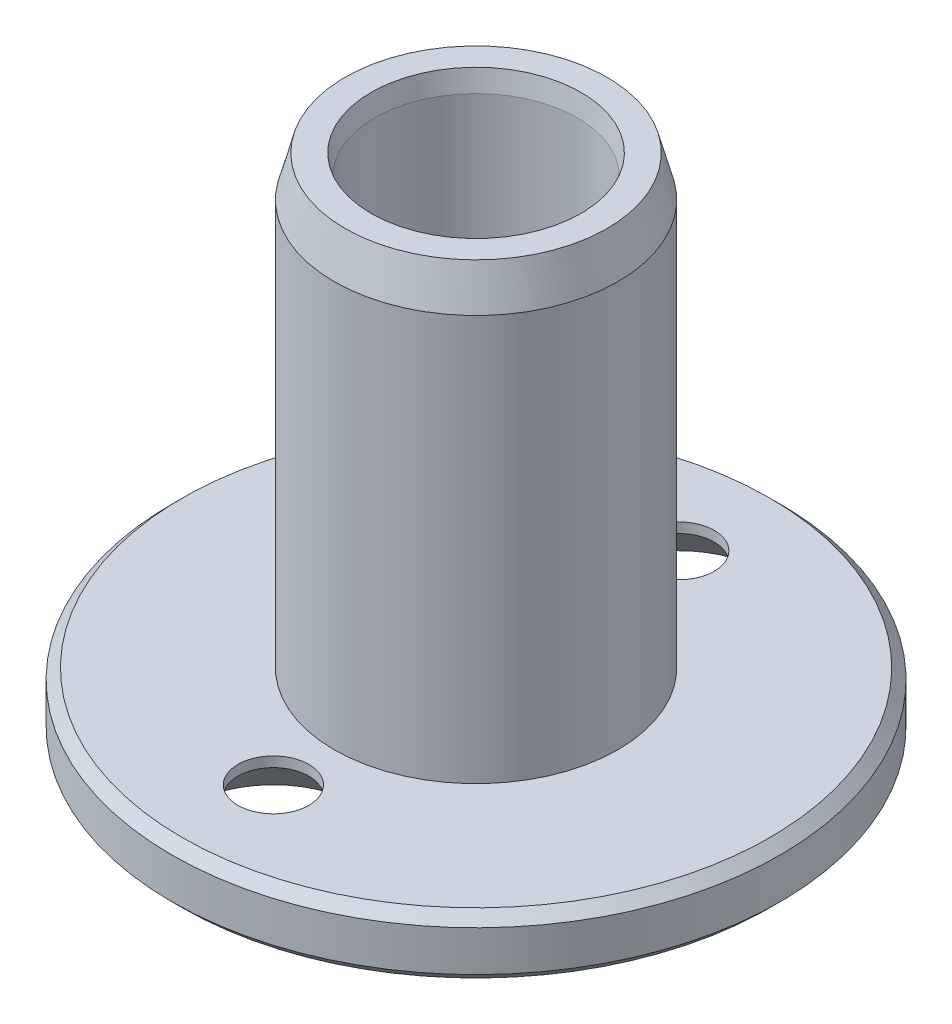
ISO-10303-21;
HEADER;
FILE_DESCRIPTION(('STEP AP214'),'2;1');
FILE_NAME('part.step','',(''),(''),'','','');
FILE_SCHEMA(('AUTOMOTIVE_DESIGN { 1 0 10303 214 1 1 1 1 }'));
ENDSEC;
DATA;
#1=APPLICATION_CONTEXT('core data for automotive mechanical design processes');
#2=APPLICATION_PROTOCOL_DEFINITION('international standard','automotive_design',2000,#1);
#3=PRODUCT_CONTEXT('',#1,'mechanical');
#4=PRODUCT('Part','Part','',(#3));
#5=PRODUCT_RELATED_PRODUCT_CATEGORY('part','',(#4));
#6=PRODUCT_DEFINITION_FORMATION('','',#4);
#7=PRODUCT_DEFINITION_CONTEXT('part definition',#1,'design');
#8=PRODUCT_DEFINITION('design','',#6,#7);
#9=PRODUCT_DEFINITION_SHAPE('','',#8);
#10=(LENGTH_UNIT() NAMED_UNIT(*) SI_UNIT(.MILLI.,.METRE.));
#11=(NAMED_UNIT(*) PLANE_ANGLE_UNIT() SI_UNIT($,.RADIAN.));
#12=(NAMED_UNIT(*) SI_UNIT($,.STERADIAN.) SOLID_ANGLE_UNIT());
#13=UNCERTAINTY_MEASURE_WITH_UNIT(LENGTH_MEASURE(1.E-05),#10,'distance_accuracy_value','');
#14=(GEOMETRIC_REPRESENTATION_CONTEXT(3) GLOBAL_UNCERTAINTY_ASSIGNED_CONTEXT((#13)) GLOBAL_UNIT_ASSIGNED_CONTEXT((#10,
#11,#12)) REPRESENTATION_CONTEXT('',''));
#15=CARTESIAN_POINT('',(0.,0.,0.));
#16=DIRECTION('',(0.,0.,1.));
#17=DIRECTION('',(1.,0.,0.));
#18=AXIS2_PLACEMENT_3D('',#15,#16,#17);
#19=CARTESIAN_POINT('',(0.,3.,0.));
#20=DIRECTION('',(0.,1.,0.));
#21=DIRECTION('',(0.,0.,1.));
#22=AXIS2_PLACEMENT_3D('',#19,#20,#21);
#23=PLANE('',#22);
#24=CARTESIAN_POINT('',(0.,3.,0.));
#25=DIRECTION('',(0.,1.,0.));
#26=DIRECTION('',(0.,0.,1.));
#27=AXIS2_PLACEMENT_3D('',#24,#25,#26);
#28=CIRCLE('',#27,14.5);
#29=CARTESIAN_POINT('',(0.,3.,14.5));
#30=VERTEX_POINT('',#29);
#31=EDGE_CURVE('E11',#30,#30,#28,.T.);
#32=ORIENTED_EDGE('',*,*,#31,.T.);
#33=EDGE_LOOP('',(#32));
#34=FACE_BOUND('',#33,.T.);
#35=CARTESIAN_POINT('',(0.,3.,-10.));
#36=DIRECTION('',(0.,1.,0.));
#37=DIRECTION('',(0.,0.,1.));
#38=AXIS2_PLACEMENT_3D('',#35,#36,#37);
#39=CIRCLE('',#38,1.75);
#40=CARTESIAN_POINT('',(0.,3.,-8.25));
#41=VERTEX_POINT('',#40);
#42=EDGE_CURVE('E105',#41,#41,#39,.F.);
#43=ORIENTED_EDGE('',*,*,#42,.T.);
#44=EDGE_LOOP('',(#43));
#45=FACE_BOUND('',#44,.T.);
#46=CARTESIAN_POINT('',(0.,3.,10.));
#47=DIRECTION('',(0.,1.,0.));
#48=DIRECTION('',(0.,0.,1.));
#49=AXIS2_PLACEMENT_3D('',#46,#47,#48);
#50=CIRCLE('',#49,1.75);
#51=CARTESIAN_POINT('',(0.,3.,11.75));
#52=VERTEX_POINT('',#51);
#53=EDGE_CURVE('E102',#52,#52,#50,.T.);
#54=ORIENTED_EDGE('',*,*,#53,.F.);
#55=EDGE_LOOP('',(#54));
#56=FACE_BOUND('',#55,.T.);
#57=CARTESIAN_POINT('',(0.,3.,0.));
#58=DIRECTION('',(0.,1.,0.));
#59=DIRECTION('',(0.,0.,1.));
#60=AXIS2_PLACEMENT_3D('',#57,#58,#59);
#61=CIRCLE('',#60,7.);
#62=CARTESIAN_POINT('',(0.,3.,7.));
#63=VERTEX_POINT('',#62);
#64=EDGE_CURVE('E99',#63,#63,#61,.F.);
#65=ORIENTED_EDGE('',*,*,#64,.T.);
#66=EDGE_LOOP('',(#65));
#67=FACE_BOUND('',#66,.T.);
#68=ADVANCED_FACE('F48',(#34,#45,#56,#67),#23,.T.);
#69=CARTESIAN_POINT('',(0.,0.,0.));
#70=DIRECTION('',(0.,1.,0.));
#71=DIRECTION('',(0.,0.,1.));
#72=AXIS2_PLACEMENT_3D('',#69,#70,#71);
#73=PLANE('',#72);
#74=CARTESIAN_POINT('',(0.,0.,0.));
#75=DIRECTION('',(0.,1.,0.));
#76=DIRECTION('',(0.,0.,1.));
#77=AXIS2_PLACEMENT_3D('',#74,#75,#76);
#78=CIRCLE('',#77,14.5);
#79=CARTESIAN_POINT('',(0.,0.,14.5));
#80=VERTEX_POINT('',#79);
#81=EDGE_CURVE('E56',#80,#80,#78,.F.);
#82=ORIENTED_EDGE('',*,*,#81,.T.);
#83=EDGE_LOOP('',(#82));
#84=FACE_BOUND('',#83,.T.);
#85=CARTESIAN_POINT('',(0.,0.,0.));
#86=DIRECTION('',(0.,1.,0.));
#87=DIRECTION('',(0.,0.,1.));
#88=AXIS2_PLACEMENT_3D('',#85,#86,#87);
#89=CIRCLE('',#88,5.17632698070847);
#90=CARTESIAN_POINT('',(0.,0.,5.17632698070847));
#91=VERTEX_POINT('',#90);
#92=EDGE_CURVE('E69',#91,#91,#89,.T.);
#93=ORIENTED_EDGE('',*,*,#92,.T.);
#94=EDGE_LOOP('',(#93));
#95=FACE_BOUND('',#94,.T.);
#96=CARTESIAN_POINT('',(0.,0.,-10.));
#97=DIRECTION('',(0.,1.,0.));
#98=DIRECTION('',(0.,0.,1.));
#99=AXIS2_PLACEMENT_3D('',#96,#97,#98);
#100=CIRCLE('',#99,4.25000000000004);
#101=CARTESIAN_POINT('',(0.,0.,-5.74999999999996));
#102=VERTEX_POINT('',#101);
#103=EDGE_CURVE('E90',#102,#102,#100,.T.);
#104=ORIENTED_EDGE('',*,*,#103,.T.);
#105=EDGE_LOOP('',(#104));
#106=FACE_BOUND('',#105,.T.);
#107=CARTESIAN_POINT('',(0.,0.,10.));
#108=DIRECTION('',(0.,1.,0.));
#109=DIRECTION('',(0.,0.,1.));
#110=AXIS2_PLACEMENT_3D('',#107,#108,#109);
#111=CIRCLE('',#110,4.24999999999999);
#112=CARTESIAN_POINT('',(0.,0.,14.25));
#113=VERTEX_POINT('',#112);
#114=EDGE_CURVE('E93',#113,#113,#111,.T.);
#115=ORIENTED_EDGE('',*,*,#114,.T.);
#116=EDGE_LOOP('',(#115));
#117=FACE_BOUND('',#116,.T.);
#118=ADVANCED_FACE('F129',(#84,#95,#106,#117),#73,.F.);
#119=CARTESIAN_POINT('',(0.,3.,0.));
#120=DIRECTION('',(0.,-1.,0.));
#121=DIRECTION('',(0.,0.,-1.));
#122=AXIS2_PLACEMENT_3D('',#119,#120,#121);
#123=CYLINDRICAL_SURFACE('',#122,15.);
#124=CARTESIAN_POINT('',(0.,0.500000000000004,0.));
#125=DIRECTION('',(0.,1.,0.));
#126=DIRECTION('',(0.,0.,1.));
#127=AXIS2_PLACEMENT_3D('',#124,#125,#126);
#128=CIRCLE('',#127,15.);
#129=CARTESIAN_POINT('',(0.,0.500000000000004,15.));
#130=VERTEX_POINT('',#129);
#131=EDGE_CURVE('E60',#130,#130,#128,.T.);
#132=ORIENTED_EDGE('',*,*,#131,.T.);
#133=EDGE_LOOP('',(#132));
#134=FACE_BOUND('',#133,.T.);
#135=CARTESIAN_POINT('',(0.,2.50000000000001,0.));
#136=DIRECTION('',(0.,1.,0.));
#137=DIRECTION('',(0.,0.,1.));
#138=AXIS2_PLACEMENT_3D('',#135,#136,#137);
#139=CIRCLE('',#138,15.);
#140=CARTESIAN_POINT('',(0.,2.50000000000001,15.));
#141=VERTEX_POINT('',#140);
#142=EDGE_CURVE('E64',#141,#141,#139,.F.);
#143=ORIENTED_EDGE('',*,*,#142,.T.);
#144=EDGE_LOOP('',(#143));
#145=FACE_BOUND('',#144,.T.);
#146=ADVANCED_FACE('F134',(#134,#145),#123,.T.);
#147=CARTESIAN_POINT('',(0.,3.,0.));
#148=DIRECTION('',(0.,-1.,0.));
#149=DIRECTION('',(0.,0.,-1.));
#150=AXIS2_PLACEMENT_3D('',#147,#148,#149);
#151=CYLINDRICAL_SURFACE('',#150,5.);
#152=CARTESIAN_POINT('',(0.,24.,0.));
#153=DIRECTION('',(0.,1.,0.));
#154=DIRECTION('',(0.,0.,1.));
#155=AXIS2_PLACEMENT_3D('',#152,#153,#154);
#156=CIRCLE('',#155,5.);
#157=CARTESIAN_POINT('',(0.,24.,5.));
#158=VERTEX_POINT('',#157);
#159=EDGE_CURVE('E75',#158,#158,#156,.T.);
#160=ORIENTED_EDGE('',*,*,#159,.T.);
#161=EDGE_LOOP('',(#160));
#162=FACE_BOUND('',#161,.T.);
#163=CARTESIAN_POINT('',(0.,1.00000000000004,0.));
#164=DIRECTION('',(0.,1.,0.));
#165=DIRECTION('',(0.,0.,1.));
#166=AXIS2_PLACEMENT_3D('',#163,#164,#165);
#167=CIRCLE('',#166,5.);
#168=CARTESIAN_POINT('',(0.,1.00000000000004,5.));
#169=VERTEX_POINT('',#168);
#170=EDGE_CURVE('E78',#169,#169,#167,.F.);
#171=ORIENTED_EDGE('',*,*,#170,.T.);
#172=EDGE_LOOP('',(#171));
#173=FACE_BOUND('',#172,.T.);
#174=ADVANCED_FACE('F137',(#162,#173),#151,.F.);
#175=CARTESIAN_POINT('',(0.,25.,0.));
#176=DIRECTION('',(0.,1.,0.));
#177=DIRECTION('',(0.,0.,1.));
#178=AXIS2_PLACEMENT_3D('',#175,#176,#177);
#179=PLANE('',#178);
#180=CARTESIAN_POINT('',(0.,25.,0.));
#181=DIRECTION('',(0.,1.,0.));
#182=DIRECTION('',(0.,0.,1.));
#183=AXIS2_PLACEMENT_3D('',#180,#181,#182);
#184=CIRCLE('',#183,5.17632698070847);
#185=CARTESIAN_POINT('',(0.,25.,5.17632698070847));
#186=VERTEX_POINT('',#185);
#187=EDGE_CURVE('E72',#186,#186,#184,.F.);
#188=ORIENTED_EDGE('',*,*,#187,.T.);
#189=EDGE_LOOP('',(#188));
#190=FACE_BOUND('',#189,.T.);
#191=CARTESIAN_POINT('',(0.,25.,0.));
#192=DIRECTION('',(0.,1.,0.));
#193=DIRECTION('',(0.,0.,1.));
#194=AXIS2_PLACEMENT_3D('',#191,#192,#193);
#195=CIRCLE('',#194,6.46410161513775);
#196=CARTESIAN_POINT('',(0.,25.,6.46410161513775));
#197=VERTEX_POINT('',#196);
#198=EDGE_CURVE('E84',#197,#197,#195,.T.);
#199=ORIENTED_EDGE('',*,*,#198,.T.);
#200=EDGE_LOOP('',(#199));
#201=FACE_BOUND('',#200,.T.);
#202=ADVANCED_FACE('F226',(#190,#201),#179,.T.);
#203=CARTESIAN_POINT('',(0.,25.,0.));
#204=DIRECTION('',(0.,-1.,0.));
#205=DIRECTION('',(0.,0.,-1.));
#206=AXIS2_PLACEMENT_3D('',#203,#204,#205);
#207=CYLINDRICAL_SURFACE('',#206,7.);
#208=CARTESIAN_POINT('',(0.,22.9999999999999,0.));
#209=DIRECTION('',(0.,1.,0.));
#210=DIRECTION('',(0.,0.,1.));
#211=AXIS2_PLACEMENT_3D('',#208,#209,#210);
#212=CIRCLE('',#211,7.);
#213=CARTESIAN_POINT('',(0.,22.9999999999999,7.));
#214=VERTEX_POINT('',#213);
#215=EDGE_CURVE('E81',#214,#214,#212,.F.);
#216=ORIENTED_EDGE('',*,*,#215,.T.);
#217=EDGE_LOOP('',(#216));
#218=FACE_BOUND('',#217,.T.);
#219=ORIENTED_EDGE('',*,*,#64,.F.);
#220=EDGE_LOOP('',(#219));
#221=FACE_BOUND('',#220,.T.);
#222=ADVANCED_FACE('F231',(#218,#221),#207,.T.);
#223=CARTESIAN_POINT('',(0.,25.,10.));
#224=DIRECTION('',(0.,-1.,0.));
#225=DIRECTION('',(0.,0.,-1.));
#226=AXIS2_PLACEMENT_3D('',#223,#224,#225);
#227=CYLINDRICAL_SURFACE('',#226,1.75);
#228=CARTESIAN_POINT('',(0.,2.49999999999998,10.));
#229=DIRECTION('',(0.,1.,0.));
#230=DIRECTION('',(0.,0.,1.));
#231=AXIS2_PLACEMENT_3D('',#228,#229,#230);
#232=CIRCLE('',#231,1.75);
#233=CARTESIAN_POINT('',(0.,2.49999999999998,11.75));
#234=VERTEX_POINT('',#233);
#235=EDGE_CURVE('E96',#234,#234,#232,.F.);
#236=ORIENTED_EDGE('',*,*,#235,.T.);
#237=EDGE_LOOP('',(#236));
#238=FACE_BOUND('',#237,.T.);
#239=ORIENTED_EDGE('',*,*,#53,.T.);
#240=EDGE_LOOP('',(#239));
#241=FACE_BOUND('',#240,.T.);
#242=ADVANCED_FACE('F124',(#238,#241),#227,.F.);
#243=CARTESIAN_POINT('',(0.,2.49999999999998,10.));
#244=DIRECTION('',(0.,-1.,0.));
#245=DIRECTION('',(0.,0.,-1.));
#246=AXIS2_PLACEMENT_3D('',#243,#244,#245);
#247=CONICAL_SURFACE('',#246,1.75,0.78539816339745);
#248=ORIENTED_EDGE('',*,*,#114,.F.);
#249=EDGE_LOOP('',(#248));
#250=FACE_BOUND('',#249,.T.);
#251=ORIENTED_EDGE('',*,*,#235,.F.);
#252=EDGE_LOOP('',(#251));
#253=FACE_BOUND('',#252,.T.);
#254=ADVANCED_FACE('F114',(#250,#253),#247,.F.);
#255=CARTESIAN_POINT('',(0.,25.,-10.));
#256=DIRECTION('',(0.,-1.,0.));
#257=DIRECTION('',(0.,0.,-1.));
#258=AXIS2_PLACEMENT_3D('',#255,#256,#257);
#259=CYLINDRICAL_SURFACE('',#258,1.75);
#260=CARTESIAN_POINT('',(0.,2.50000000000002,-10.));
#261=DIRECTION('',(0.,1.,0.));
#262=DIRECTION('',(0.,0.,1.));
#263=AXIS2_PLACEMENT_3D('',#260,#261,#262);
#264=CIRCLE('',#263,1.75);
#265=CARTESIAN_POINT('',(0.,2.50000000000002,-8.25));
#266=VERTEX_POINT('',#265);
#267=EDGE_CURVE('E87',#266,#266,#264,.F.);
#268=ORIENTED_EDGE('',*,*,#267,.T.);
#269=EDGE_LOOP('',(#268));
#270=FACE_BOUND('',#269,.T.);
#271=ORIENTED_EDGE('',*,*,#42,.F.);
#272=EDGE_LOOP('',(#271));
#273=FACE_BOUND('',#272,.T.);
#274=ADVANCED_FACE('F111',(#270,#273),#259,.F.);
#275=CARTESIAN_POINT('',(0.,0.,-10.));
#276=DIRECTION('',(0.,-1.,0.));
#277=DIRECTION('',(0.,0.,-1.));
#278=AXIS2_PLACEMENT_3D('',#275,#276,#277);
#279=CONICAL_SURFACE('',#278,4.25000000000004,0.785398163397454);
#280=ORIENTED_EDGE('',*,*,#267,.F.);
#281=EDGE_LOOP('',(#280));
#282=FACE_BOUND('',#281,.T.);
#283=ORIENTED_EDGE('',*,*,#103,.F.);
#284=EDGE_LOOP('',(#283));
#285=FACE_BOUND('',#284,.T.);
#286=ADVANCED_FACE('F113',(#282,#285),#279,.F.);
#287=CARTESIAN_POINT('',(0.,25.,0.));
#288=DIRECTION('',(0.,-1.,0.));
#289=DIRECTION('',(0.,0.,-1.));
#290=AXIS2_PLACEMENT_3D('',#287,#288,#289);
#291=CONICAL_SURFACE('',#290,6.46410161513775,0.261799387799145);
#292=ORIENTED_EDGE('',*,*,#215,.F.);
#293=EDGE_LOOP('',(#292));
#294=FACE_BOUND('',#293,.T.);
#295=ORIENTED_EDGE('',*,*,#198,.F.);
#296=EDGE_LOOP('',(#295));
#297=FACE_BOUND('',#296,.T.);
#298=ADVANCED_FACE('F121',(#294,#297),#291,.T.);
#299=CARTESIAN_POINT('',(0.,24.,0.));
#300=DIRECTION('',(0.,1.,0.));
#301=DIRECTION('',(0.,0.,1.));
#302=AXIS2_PLACEMENT_3D('',#299,#300,#301);
#303=CONICAL_SURFACE('',#302,5.,0.17453292519943);
#304=ORIENTED_EDGE('',*,*,#187,.F.);
#305=EDGE_LOOP('',(#304));
#306=FACE_BOUND('',#305,.T.);
#307=ORIENTED_EDGE('',*,*,#159,.F.);
#308=EDGE_LOOP('',(#307));
#309=FACE_BOUND('',#308,.T.);
#310=ADVANCED_FACE('F155',(#306,#309),#303,.F.);
#311=CARTESIAN_POINT('',(0.,0.,0.));
#312=DIRECTION('',(0.,-1.,0.));
#313=DIRECTION('',(0.,0.,-1.));
#314=AXIS2_PLACEMENT_3D('',#311,#312,#313);
#315=CONICAL_SURFACE('',#314,5.17632698070847,0.17453292519943);
#316=ORIENTED_EDGE('',*,*,#170,.F.);
#317=EDGE_LOOP('',(#316));
#318=FACE_BOUND('',#317,.T.);
#319=ORIENTED_EDGE('',*,*,#92,.F.);
#320=EDGE_LOOP('',(#319));
#321=FACE_BOUND('',#320,.T.);
#322=ADVANCED_FACE('F162',(#318,#321),#315,.F.);
#323=CARTESIAN_POINT('',(0.,0.500000000000004,0.));
#324=DIRECTION('',(0.,1.,0.));
#325=DIRECTION('',(0.,0.,1.));
#326=AXIS2_PLACEMENT_3D('',#323,#324,#325);
#327=CONICAL_SURFACE('',#326,15.,0.78539816339745);
#328=ORIENTED_EDGE('',*,*,#81,.F.);
#329=EDGE_LOOP('',(#328));
#330=FACE_BOUND('',#329,.T.);
#331=ORIENTED_EDGE('',*,*,#131,.F.);
#332=EDGE_LOOP('',(#331));
#333=FACE_BOUND('',#332,.T.);
#334=ADVANCED_FACE('F168',(#330,#333),#327,.T.);
#335=CARTESIAN_POINT('',(0.,3.,0.));
#336=DIRECTION('',(0.,-1.,0.));
#337=DIRECTION('',(0.,0.,-1.));
#338=AXIS2_PLACEMENT_3D('',#335,#336,#337);
#339=CONICAL_SURFACE('',#338,14.5,0.78539816339745);
#340=ORIENTED_EDGE('',*,*,#142,.F.);
#341=EDGE_LOOP('',(#340));
#342=FACE_BOUND('',#341,.T.);
#343=ORIENTED_EDGE('',*,*,#31,.F.);
#344=EDGE_LOOP('',(#343));
#345=FACE_BOUND('',#344,.T.);
#346=ADVANCED_FACE('F51',(#342,#345),#339,.T.);
#347=CLOSED_SHELL('',(#68,#118,#146,#174,#202,#222,#242,#254,#274,#286,#298,#310,#322,#334,#346));
#348=MANIFOLD_SOLID_BREP('B2',#347);
#349=ADVANCED_BREP_SHAPE_REPRESENTATION('',(#18,#348),#14);
#350=SHAPE_DEFINITION_REPRESENTATION(#9,#349);
ENDSEC;
END-ISO-10303-21;
